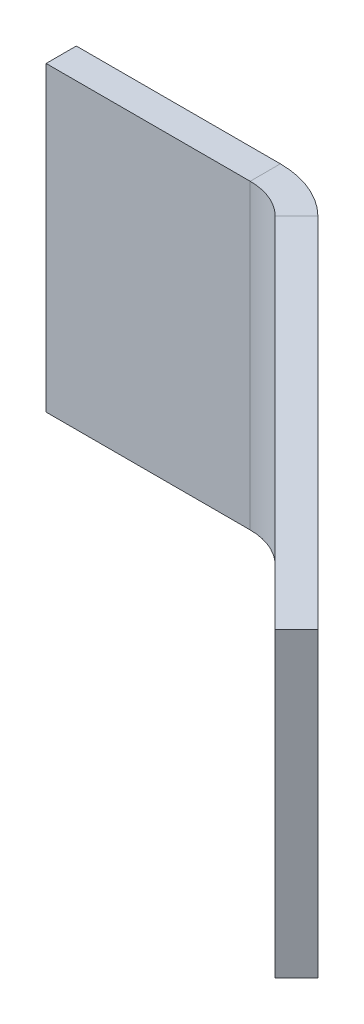
ISO-10303-21;
HEADER;
FILE_DESCRIPTION(('STEP AP214'),'2;1');
FILE_NAME('part.step','',(''),(''),'','','');
FILE_SCHEMA(('AUTOMOTIVE_DESIGN { 1 0 10303 214 1 1 1 1 }'));
ENDSEC;
DATA;
#1=APPLICATION_CONTEXT('core data for automotive mechanical design processes');
#2=APPLICATION_PROTOCOL_DEFINITION('international standard','automotive_design',2000,#1);
#3=PRODUCT_CONTEXT('',#1,'mechanical');
#4=PRODUCT('Part','Part','',(#3));
#5=PRODUCT_RELATED_PRODUCT_CATEGORY('part','',(#4));
#6=PRODUCT_DEFINITION_FORMATION('','',#4);
#7=PRODUCT_DEFINITION_CONTEXT('part definition',#1,'design');
#8=PRODUCT_DEFINITION('design','',#6,#7);
#9=PRODUCT_DEFINITION_SHAPE('','',#8);
#10=(LENGTH_UNIT() NAMED_UNIT(*) SI_UNIT(.MILLI.,.METRE.));
#11=(NAMED_UNIT(*) PLANE_ANGLE_UNIT() SI_UNIT($,.RADIAN.));
#12=(NAMED_UNIT(*) SI_UNIT($,.STERADIAN.) SOLID_ANGLE_UNIT());
#13=UNCERTAINTY_MEASURE_WITH_UNIT(LENGTH_MEASURE(1.E-05),#10,'distance_accuracy_value','');
#14=(GEOMETRIC_REPRESENTATION_CONTEXT(3) GLOBAL_UNCERTAINTY_ASSIGNED_CONTEXT((#13)) GLOBAL_UNIT_ASSIGNED_CONTEXT((#10,
#11,#12)) REPRESENTATION_CONTEXT('',''));
#15=CARTESIAN_POINT('',(0.,0.,0.));
#16=DIRECTION('',(0.,0.,1.));
#17=DIRECTION('',(1.,0.,0.));
#18=AXIS2_PLACEMENT_3D('',#15,#16,#17);
#19=CARTESIAN_POINT('',(8.87867965644036,10.,0.878679656440362));
#20=DIRECTION('',(0.,1.,0.));
#21=DIRECTION('',(0.,0.,1.));
#22=AXIS2_PLACEMENT_3D('',#19,#20,#21);
#23=PLANE('',#22);
#24=DIRECTION('',(-0.707106781186549,0.,0.707106781186547));
#25=VECTOR('',#24,1.);
#26=CARTESIAN_POINT('',(8.87867965644036,10.,0.878679656440362));
#27=LINE('',#26,#25);
#28=CARTESIAN_POINT('',(8.87867965644036,10.,0.878679656440362));
#29=VERTEX_POINT('',#28);
#30=CARTESIAN_POINT('',(8.17157287525381,10.,1.58578643762691));
#31=VERTEX_POINT('',#30);
#32=EDGE_CURVE('E11',#29,#31,#27,.T.);
#33=ORIENTED_EDGE('',*,*,#32,.F.);
#34=CARTESIAN_POINT('',(6.75735931288071,10.,3.));
#35=DIRECTION('',(0.,1.,0.));
#36=DIRECTION('',(0.,0.,1.));
#37=AXIS2_PLACEMENT_3D('',#34,#35,#36);
#38=CIRCLE('',#37,3.);
#39=CARTESIAN_POINT('',(6.75735931288071,10.,0.));
#40=VERTEX_POINT('',#39);
#41=EDGE_CURVE('E134',#40,#29,#38,.F.);
#42=ORIENTED_EDGE('',*,*,#41,.F.);
#43=DIRECTION('',(0.,0.,-1.));
#44=VECTOR('',#43,1.);
#45=CARTESIAN_POINT('',(6.75735931288071,10.,1.));
#46=LINE('',#45,#44);
#47=CARTESIAN_POINT('',(6.75735931288071,10.,1.));
#48=VERTEX_POINT('',#47);
#49=EDGE_CURVE('E45',#48,#40,#46,.T.);
#50=ORIENTED_EDGE('',*,*,#49,.F.);
#51=CARTESIAN_POINT('',(6.75735931288071,10.,3.));
#52=DIRECTION('',(0.,1.,0.));
#53=DIRECTION('',(1.,0.,0.));
#54=AXIS2_PLACEMENT_3D('',#51,#52,#53);
#55=CIRCLE('',#54,2.);
#56=EDGE_CURVE('E127',#48,#31,#55,.F.);
#57=ORIENTED_EDGE('',*,*,#56,.T.);
#58=EDGE_LOOP('',(#33,#42,#50,#57));
#59=FACE_BOUND('',#58,.T.);
#60=ADVANCED_FACE('F36',(#59),#23,.T.);
#61=CARTESIAN_POINT('',(6.75735931288071,10.,1.));
#62=DIRECTION('',(0.,1.,0.));
#63=DIRECTION('',(0.,0.,1.));
#64=AXIS2_PLACEMENT_3D('',#61,#62,#63);
#65=PLANE('',#64);
#66=DIRECTION('',(0.707106781186546,0.,0.707106781186549));
#67=VECTOR('',#66,1.);
#68=CARTESIAN_POINT('',(8.,10.,0.));
#69=LINE('',#68,#67);
#70=CARTESIAN_POINT('',(20.7279220613578,10.,12.7279220613579));
#71=VERTEX_POINT('',#70);
#72=EDGE_CURVE('E184',#29,#71,#69,.T.);
#73=ORIENTED_EDGE('',*,*,#72,.F.);
#74=ORIENTED_EDGE('',*,*,#32,.T.);
#75=DIRECTION('',(0.707106781186546,0.,0.707106781186549));
#76=VECTOR('',#75,1.);
#77=CARTESIAN_POINT('',(7.29289321881345,10.,0.707106781186546));
#78=LINE('',#77,#76);
#79=CARTESIAN_POINT('',(20.0208152801713,10.,13.4350288425444));
#80=VERTEX_POINT('',#79);
#81=EDGE_CURVE('E93',#31,#80,#78,.T.);
#82=ORIENTED_EDGE('',*,*,#81,.T.);
#83=DIRECTION('',(-0.707106781186548,0.,0.707106781186547));
#84=VECTOR('',#83,1.);
#85=CARTESIAN_POINT('',(20.7279220613578,10.,12.7279220613579));
#86=LINE('',#85,#84);
#87=EDGE_CURVE('E359',#71,#80,#86,.T.);
#88=ORIENTED_EDGE('',*,*,#87,.F.);
#89=EDGE_LOOP('',(#73,#74,#82,#88));
#90=FACE_BOUND('',#89,.T.);
#91=ADVANCED_FACE('F192',(#90),#65,.T.);
#92=CARTESIAN_POINT('',(6.75735931288071,0.,0.));
#93=DIRECTION('',(0.,-1.,0.));
#94=DIRECTION('',(0.,0.,-1.));
#95=AXIS2_PLACEMENT_3D('',#92,#93,#94);
#96=PLANE('',#95);
#97=DIRECTION('',(0.,0.,1.));
#98=VECTOR('',#97,1.);
#99=CARTESIAN_POINT('',(6.75735931288071,0.,0.));
#100=LINE('',#99,#98);
#101=CARTESIAN_POINT('',(6.75735931288071,0.,0.));
#102=VERTEX_POINT('',#101);
#103=CARTESIAN_POINT('',(6.75735931288071,0.,1.));
#104=VERTEX_POINT('',#103);
#105=EDGE_CURVE('E80',#102,#104,#100,.T.);
#106=ORIENTED_EDGE('',*,*,#105,.F.);
#107=CARTESIAN_POINT('',(6.75735931288071,0.,3.));
#108=DIRECTION('',(0.,1.,0.));
#109=DIRECTION('',(0.,0.,1.));
#110=AXIS2_PLACEMENT_3D('',#107,#108,#109);
#111=CIRCLE('',#110,3.);
#112=CARTESIAN_POINT('',(8.87867965644036,0.,0.878679656440362));
#113=VERTEX_POINT('',#112);
#114=EDGE_CURVE('E149',#102,#113,#111,.F.);
#115=ORIENTED_EDGE('',*,*,#114,.T.);
#116=DIRECTION('',(0.707106781186549,0.,-0.707106781186547));
#117=VECTOR('',#116,1.);
#118=CARTESIAN_POINT('',(8.17157287525381,0.,1.58578643762691));
#119=LINE('',#118,#117);
#120=CARTESIAN_POINT('',(8.17157287525381,0.,1.58578643762691));
#121=VERTEX_POINT('',#120);
#122=EDGE_CURVE('E87',#121,#113,#119,.T.);
#123=ORIENTED_EDGE('',*,*,#122,.F.);
#124=CARTESIAN_POINT('',(6.75735931288071,0.,3.));
#125=DIRECTION('',(0.,1.,0.));
#126=DIRECTION('',(1.,0.,0.));
#127=AXIS2_PLACEMENT_3D('',#124,#125,#126);
#128=CIRCLE('',#127,2.);
#129=EDGE_CURVE('E156',#104,#121,#128,.F.);
#130=ORIENTED_EDGE('',*,*,#129,.F.);
#131=EDGE_LOOP('',(#106,#115,#123,#130));
#132=FACE_BOUND('',#131,.T.);
#133=ADVANCED_FACE('F190',(#132),#96,.T.);
#134=CARTESIAN_POINT('',(8.17157287525381,0.,1.58578643762691));
#135=DIRECTION('',(0.,-1.,0.));
#136=DIRECTION('',(0.,0.,-1.));
#137=AXIS2_PLACEMENT_3D('',#134,#135,#136);
#138=PLANE('',#137);
#139=DIRECTION('',(1.,0.,0.));
#140=VECTOR('',#139,1.);
#141=CARTESIAN_POINT('',(0.,0.,0.));
#142=LINE('',#141,#140);
#143=CARTESIAN_POINT('',(0.,0.,0.));
#144=VERTEX_POINT('',#143);
#145=EDGE_CURVE('E151',#144,#102,#142,.T.);
#146=ORIENTED_EDGE('',*,*,#145,.T.);
#147=ORIENTED_EDGE('',*,*,#105,.T.);
#148=DIRECTION('',(1.,0.,0.));
#149=VECTOR('',#148,1.);
#150=CARTESIAN_POINT('',(0.,0.,1.));
#151=LINE('',#150,#149);
#152=CARTESIAN_POINT('',(0.,0.,1.));
#153=VERTEX_POINT('',#152);
#154=EDGE_CURVE('E154',#153,#104,#151,.T.);
#155=ORIENTED_EDGE('',*,*,#154,.F.);
#156=DIRECTION('',(0.,0.,-1.));
#157=VECTOR('',#156,1.);
#158=CARTESIAN_POINT('',(0.,0.,1.));
#159=LINE('',#158,#157);
#160=EDGE_CURVE('E115',#153,#144,#159,.T.);
#161=ORIENTED_EDGE('',*,*,#160,.T.);
#162=EDGE_LOOP('',(#146,#147,#155,#161));
#163=FACE_BOUND('',#162,.T.);
#164=ADVANCED_FACE('F186',(#163),#138,.T.);
#165=CARTESIAN_POINT('',(7.29289321881345,10.,0.707106781186546));
#166=DIRECTION('',(0.707106781186549,0.,-0.707106781186546));
#167=DIRECTION('',(-0.707106781186546,0.,-0.707106781186549));
#168=AXIS2_PLACEMENT_3D('',#165,#166,#167);
#169=PLANE('',#168);
#170=CARTESIAN_POINT('',(17.1923881554251,5.,10.6066017177982));
#171=DIRECTION('',(-0.707106781186549,0.,0.707106781186546));
#172=DIRECTION('',(0.707106781186546,0.,0.707106781186549));
#173=AXIS2_PLACEMENT_3D('',#170,#171,#172);
#174=CIRCLE('',#173,1.5);
#175=CARTESIAN_POINT('',(18.2530483272049,5.,11.667261889578));
#176=VERTEX_POINT('',#175);
#177=EDGE_CURVE('E355',#176,#176,#174,.T.);
#178=ORIENTED_EDGE('',*,*,#177,.F.);
#179=EDGE_LOOP('',(#178));
#180=FACE_BOUND('',#179,.T.);
#181=DIRECTION('',(0.707106781186546,0.,0.707106781186549));
#182=VECTOR('',#181,1.);
#183=CARTESIAN_POINT('',(7.29289321881345,0.,0.707106781186546));
#184=LINE('',#183,#182);
#185=CARTESIAN_POINT('',(20.0208152801713,0.,13.4350288425444));
#186=VERTEX_POINT('',#185);
#187=EDGE_CURVE('E140',#121,#186,#184,.T.);
#188=ORIENTED_EDGE('',*,*,#187,.T.);
#189=DIRECTION('',(0.,-1.,0.));
#190=VECTOR('',#189,1.);
#191=CARTESIAN_POINT('',(20.0208152801713,10.,13.4350288425444));
#192=LINE('',#191,#190);
#193=EDGE_CURVE('E170',#80,#186,#192,.T.);
#194=ORIENTED_EDGE('',*,*,#193,.F.);
#195=ORIENTED_EDGE('',*,*,#81,.F.);
#196=DIRECTION('',(0.,-1.,0.));
#197=VECTOR('',#196,1.);
#198=CARTESIAN_POINT('',(8.17157287525381,10.,1.58578643762691));
#199=LINE('',#198,#197);
#200=EDGE_CURVE('E139',#31,#121,#199,.T.);
#201=ORIENTED_EDGE('',*,*,#200,.T.);
#202=EDGE_LOOP('',(#188,#194,#195,#201));
#203=FACE_BOUND('',#202,.T.);
#204=ADVANCED_FACE('F198',(#180,#203),#169,.F.);
#205=CARTESIAN_POINT('',(20.7279220613578,10.,12.7279220613579));
#206=DIRECTION('',(0.707106781186547,0.,0.707106781186548));
#207=DIRECTION('',(0.707106781186548,0.,-0.707106781186547));
#208=AXIS2_PLACEMENT_3D('',#205,#206,#207);
#209=PLANE('',#208);
#210=DIRECTION('',(-0.707106781186548,0.,0.707106781186547));
#211=VECTOR('',#210,1.);
#212=CARTESIAN_POINT('',(20.7279220613578,0.,12.7279220613579));
#213=LINE('',#212,#211);
#214=CARTESIAN_POINT('',(20.7279220613578,0.,12.7279220613579));
#215=VERTEX_POINT('',#214);
#216=EDGE_CURVE('E143',#215,#186,#213,.T.);
#217=ORIENTED_EDGE('',*,*,#216,.F.);
#218=DIRECTION('',(0.,-1.,0.));
#219=VECTOR('',#218,1.);
#220=CARTESIAN_POINT('',(20.7279220613578,10.,12.7279220613579));
#221=LINE('',#220,#219);
#222=EDGE_CURVE('E168',#71,#215,#221,.T.);
#223=ORIENTED_EDGE('',*,*,#222,.F.);
#224=ORIENTED_EDGE('',*,*,#87,.T.);
#225=ORIENTED_EDGE('',*,*,#193,.T.);
#226=EDGE_LOOP('',(#217,#223,#224,#225));
#227=FACE_BOUND('',#226,.T.);
#228=ADVANCED_FACE('F227',(#227),#209,.T.);
#229=CARTESIAN_POINT('',(8.,10.,0.));
#230=DIRECTION('',(0.707106781186549,0.,-0.707106781186546));
#231=DIRECTION('',(-0.707106781186546,0.,-0.707106781186549));
#232=AXIS2_PLACEMENT_3D('',#229,#230,#231);
#233=PLANE('',#232);
#234=CARTESIAN_POINT('',(17.8994949366116,5.,9.89949493661168));
#235=DIRECTION('',(0.707106781186549,0.,-0.707106781186546));
#236=DIRECTION('',(-0.707106781186546,0.,-0.707106781186549));
#237=AXIS2_PLACEMENT_3D('',#234,#235,#236);
#238=CIRCLE('',#237,1.5);
#239=CARTESIAN_POINT('',(16.8388347648318,5.,8.83883476483186));
#240=VERTEX_POINT('',#239);
#241=EDGE_CURVE('E39',#240,#240,#238,.T.);
#242=ORIENTED_EDGE('',*,*,#241,.F.);
#243=EDGE_LOOP('',(#242));
#244=FACE_BOUND('',#243,.T.);
#245=DIRECTION('',(0.707106781186546,0.,0.707106781186549));
#246=VECTOR('',#245,1.);
#247=CARTESIAN_POINT('',(8.,0.,0.));
#248=LINE('',#247,#246);
#249=EDGE_CURVE('E146',#113,#215,#248,.T.);
#250=ORIENTED_EDGE('',*,*,#249,.F.);
#251=DIRECTION('',(0.,-1.,0.));
#252=VECTOR('',#251,1.);
#253=CARTESIAN_POINT('',(8.87867965644036,10.,0.878679656440362));
#254=LINE('',#253,#252);
#255=EDGE_CURVE('E165',#29,#113,#254,.T.);
#256=ORIENTED_EDGE('',*,*,#255,.F.);
#257=ORIENTED_EDGE('',*,*,#72,.T.);
#258=ORIENTED_EDGE('',*,*,#222,.T.);
#259=EDGE_LOOP('',(#250,#256,#257,#258));
#260=FACE_BOUND('',#259,.T.);
#261=ADVANCED_FACE('F232',(#244,#260),#233,.T.);
#262=CARTESIAN_POINT('',(6.75735931288071,10.,3.));
#263=DIRECTION('',(0.,-1.,0.));
#264=DIRECTION('',(0.,0.,-1.));
#265=AXIS2_PLACEMENT_3D('',#262,#263,#264);
#266=CYLINDRICAL_SURFACE('',#265,3.);
#267=ORIENTED_EDGE('',*,*,#114,.F.);
#268=DIRECTION('',(0.,-1.,0.));
#269=VECTOR('',#268,1.);
#270=CARTESIAN_POINT('',(6.75735931288071,10.,0.));
#271=LINE('',#270,#269);
#272=EDGE_CURVE('E162',#40,#102,#271,.T.);
#273=ORIENTED_EDGE('',*,*,#272,.F.);
#274=ORIENTED_EDGE('',*,*,#41,.T.);
#275=ORIENTED_EDGE('',*,*,#255,.T.);
#276=EDGE_LOOP('',(#267,#273,#274,#275));
#277=FACE_BOUND('',#276,.T.);
#278=ADVANCED_FACE('F180',(#277),#266,.T.);
#279=CARTESIAN_POINT('',(0.,10.,0.));
#280=DIRECTION('',(0.,0.,-1.));
#281=DIRECTION('',(-1.,0.,0.));
#282=AXIS2_PLACEMENT_3D('',#279,#280,#281);
#283=PLANE('',#282);
#284=ORIENTED_EDGE('',*,*,#145,.F.);
#285=DIRECTION('',(0.,-1.,0.));
#286=VECTOR('',#285,1.);
#287=CARTESIAN_POINT('',(0.,10.,0.));
#288=LINE('',#287,#286);
#289=CARTESIAN_POINT('',(0.,10.,0.));
#290=VERTEX_POINT('',#289);
#291=EDGE_CURVE('E117',#290,#144,#288,.T.);
#292=ORIENTED_EDGE('',*,*,#291,.F.);
#293=DIRECTION('',(1.,0.,0.));
#294=VECTOR('',#293,1.);
#295=CARTESIAN_POINT('',(0.,10.,0.));
#296=LINE('',#295,#294);
#297=EDGE_CURVE('E132',#290,#40,#296,.T.);
#298=ORIENTED_EDGE('',*,*,#297,.T.);
#299=ORIENTED_EDGE('',*,*,#272,.T.);
#300=EDGE_LOOP('',(#284,#292,#298,#299));
#301=FACE_BOUND('',#300,.T.);
#302=ADVANCED_FACE('F185',(#301),#283,.T.);
#303=CARTESIAN_POINT('',(0.,10.,1.));
#304=DIRECTION('',(-1.,0.,0.));
#305=DIRECTION('',(0.,0.,1.));
#306=AXIS2_PLACEMENT_3D('',#303,#304,#305);
#307=PLANE('',#306);
#308=ORIENTED_EDGE('',*,*,#160,.F.);
#309=DIRECTION('',(0.,-1.,0.));
#310=VECTOR('',#309,1.);
#311=CARTESIAN_POINT('',(0.,10.,1.));
#312=LINE('',#311,#310);
#313=CARTESIAN_POINT('',(0.,10.,1.));
#314=VERTEX_POINT('',#313);
#315=EDGE_CURVE('E109',#314,#153,#312,.T.);
#316=ORIENTED_EDGE('',*,*,#315,.F.);
#317=DIRECTION('',(0.,0.,-1.));
#318=VECTOR('',#317,1.);
#319=CARTESIAN_POINT('',(0.,10.,1.));
#320=LINE('',#319,#318);
#321=EDGE_CURVE('E113',#314,#290,#320,.T.);
#322=ORIENTED_EDGE('',*,*,#321,.T.);
#323=ORIENTED_EDGE('',*,*,#291,.T.);
#324=EDGE_LOOP('',(#308,#316,#322,#323));
#325=FACE_BOUND('',#324,.T.);
#326=ADVANCED_FACE('F111',(#325),#307,.T.);
#327=CARTESIAN_POINT('',(0.,10.,1.));
#328=DIRECTION('',(0.,0.,-1.));
#329=DIRECTION('',(-1.,0.,0.));
#330=AXIS2_PLACEMENT_3D('',#327,#328,#329);
#331=PLANE('',#330);
#332=ORIENTED_EDGE('',*,*,#154,.T.);
#333=DIRECTION('',(0.,-1.,0.));
#334=VECTOR('',#333,1.);
#335=CARTESIAN_POINT('',(6.75735931288071,10.,1.));
#336=LINE('',#335,#334);
#337=EDGE_CURVE('E118',#48,#104,#336,.T.);
#338=ORIENTED_EDGE('',*,*,#337,.F.);
#339=DIRECTION('',(1.,0.,0.));
#340=VECTOR('',#339,1.);
#341=CARTESIAN_POINT('',(0.,10.,1.));
#342=LINE('',#341,#340);
#343=EDGE_CURVE('E122',#314,#48,#342,.T.);
#344=ORIENTED_EDGE('',*,*,#343,.F.);
#345=ORIENTED_EDGE('',*,*,#315,.T.);
#346=EDGE_LOOP('',(#332,#338,#344,#345));
#347=FACE_BOUND('',#346,.T.);
#348=ADVANCED_FACE('F123',(#347),#331,.F.);
#349=CARTESIAN_POINT('',(6.75735931288071,10.,3.));
#350=DIRECTION('',(0.,-1.,0.));
#351=DIRECTION('',(0.,0.,-1.));
#352=AXIS2_PLACEMENT_3D('',#349,#350,#351);
#353=CYLINDRICAL_SURFACE('',#352,2.);
#354=ORIENTED_EDGE('',*,*,#129,.T.);
#355=ORIENTED_EDGE('',*,*,#200,.F.);
#356=ORIENTED_EDGE('',*,*,#56,.F.);
#357=ORIENTED_EDGE('',*,*,#337,.T.);
#358=EDGE_LOOP('',(#354,#355,#356,#357));
#359=FACE_BOUND('',#358,.T.);
#360=ADVANCED_FACE('F188',(#359),#353,.F.);
#361=CARTESIAN_POINT('',(6.75735931288071,10.,3.));
#362=DIRECTION('',(0.,1.,0.));
#363=DIRECTION('',(1.,0.,0.));
#364=AXIS2_PLACEMENT_3D('',#361,#362,#363);
#365=PLANE('',#364);
#366=ORIENTED_EDGE('',*,*,#343,.T.);
#367=ORIENTED_EDGE('',*,*,#49,.T.);
#368=ORIENTED_EDGE('',*,*,#297,.F.);
#369=ORIENTED_EDGE('',*,*,#321,.F.);
#370=EDGE_LOOP('',(#366,#367,#368,#369));
#371=FACE_BOUND('',#370,.T.);
#372=ADVANCED_FACE('F130',(#371),#365,.T.);
#373=CARTESIAN_POINT('',(6.75735931288071,0.,3.));
#374=DIRECTION('',(0.,1.,0.));
#375=DIRECTION('',(1.,0.,0.));
#376=AXIS2_PLACEMENT_3D('',#373,#374,#375);
#377=PLANE('',#376);
#378=ORIENTED_EDGE('',*,*,#187,.F.);
#379=ORIENTED_EDGE('',*,*,#122,.T.);
#380=ORIENTED_EDGE('',*,*,#249,.T.);
#381=ORIENTED_EDGE('',*,*,#216,.T.);
#382=EDGE_LOOP('',(#378,#379,#380,#381));
#383=FACE_BOUND('',#382,.T.);
#384=ADVANCED_FACE('F290',(#383),#377,.F.);
#385=CARTESIAN_POINT('',(24.2634559672906,5.,3.53553390593276));
#386=DIRECTION('',(-0.707106781186549,0.,0.707106781186546));
#387=DIRECTION('',(0.707106781186546,0.,0.707106781186549));
#388=AXIS2_PLACEMENT_3D('',#385,#386,#387);
#389=CYLINDRICAL_SURFACE('',#388,1.5);
#390=ORIENTED_EDGE('',*,*,#241,.T.);
#391=EDGE_LOOP('',(#390));
#392=FACE_BOUND('',#391,.T.);
#393=ORIENTED_EDGE('',*,*,#177,.T.);
#394=EDGE_LOOP('',(#393));
#395=FACE_BOUND('',#394,.T.);
#396=ADVANCED_FACE('F300',(#392,#395),#389,.F.);
#397=CLOSED_SHELL('',(#60,#91,#133,#164,#204,#228,#261,#278,#302,#326,#348,#360,#372,#384,#396));
#398=MANIFOLD_SOLID_BREP('B2',#397);
#399=ADVANCED_BREP_SHAPE_REPRESENTATION('',(#18,#398),#14);
#400=SHAPE_DEFINITION_REPRESENTATION(#9,#399);
ENDSEC;
END-ISO-10303-21;
